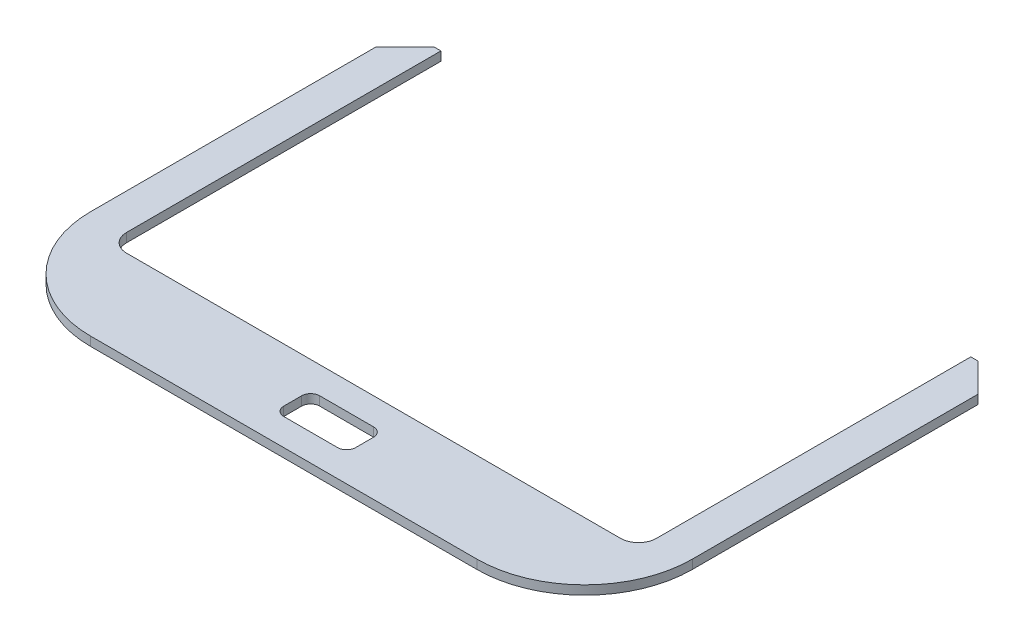
ISO-10303-21;
HEADER;
FILE_DESCRIPTION(('STEP AP214'),'2;1');
FILE_NAME('part.step','',(''),(''),'','','');
FILE_SCHEMA(('AUTOMOTIVE_DESIGN { 1 0 10303 214 1 1 1 1 }'));
ENDSEC;
DATA;
#1=APPLICATION_CONTEXT('core data for automotive mechanical design processes');
#2=APPLICATION_PROTOCOL_DEFINITION('international standard','automotive_design',2000,#1);
#3=PRODUCT_CONTEXT('',#1,'mechanical');
#4=PRODUCT('Part','Part','',(#3));
#5=PRODUCT_RELATED_PRODUCT_CATEGORY('part','',(#4));
#6=PRODUCT_DEFINITION_FORMATION('','',#4);
#7=PRODUCT_DEFINITION_CONTEXT('part definition',#1,'design');
#8=PRODUCT_DEFINITION('design','',#6,#7);
#9=PRODUCT_DEFINITION_SHAPE('','',#8);
#10=(LENGTH_UNIT() NAMED_UNIT(*) SI_UNIT(.MILLI.,.METRE.));
#11=(NAMED_UNIT(*) PLANE_ANGLE_UNIT() SI_UNIT($,.RADIAN.));
#12=(NAMED_UNIT(*) SI_UNIT($,.STERADIAN.) SOLID_ANGLE_UNIT());
#13=UNCERTAINTY_MEASURE_WITH_UNIT(LENGTH_MEASURE(1.E-05),#10,'distance_accuracy_value','');
#14=(GEOMETRIC_REPRESENTATION_CONTEXT(3) GLOBAL_UNCERTAINTY_ASSIGNED_CONTEXT((#13)) GLOBAL_UNIT_ASSIGNED_CONTEXT((#10,
#11,#12)) REPRESENTATION_CONTEXT('',''));
#15=CARTESIAN_POINT('',(0.,0.,0.));
#16=DIRECTION('',(0.,0.,1.));
#17=DIRECTION('',(1.,0.,0.));
#18=AXIS2_PLACEMENT_3D('',#15,#16,#17);
#19=CARTESIAN_POINT('',(53.18125,0.79375,-58.7375));
#20=DIRECTION('',(-1.,0.,0.));
#21=DIRECTION('',(0.,0.,1.));
#22=AXIS2_PLACEMENT_3D('',#19,#20,#21);
#23=PLANE('',#22);
#24=DIRECTION('',(0.,0.,-1.));
#25=VECTOR('',#24,1.);
#26=CARTESIAN_POINT('',(53.18125,-0.79375,-58.7375));
#27=LINE('',#26,#25);
#28=CARTESIAN_POINT('',(53.18125,-0.79375,-3.175));
#29=VERTEX_POINT('',#28);
#30=CARTESIAN_POINT('',(53.18125,-0.79375,-53.6575));
#31=VERTEX_POINT('',#30);
#32=EDGE_CURVE('E240',#29,#31,#27,.T.);
#33=ORIENTED_EDGE('',*,*,#32,.T.);
#34=DIRECTION('',(0.,1.,0.));
#35=VECTOR('',#34,1.);
#36=CARTESIAN_POINT('',(53.18125,0.79375,-53.6575));
#37=LINE('',#36,#35);
#38=CARTESIAN_POINT('',(53.18125,0.79375,-53.6575));
#39=VERTEX_POINT('',#38);
#40=EDGE_CURVE('E359',#31,#39,#37,.T.);
#41=ORIENTED_EDGE('',*,*,#40,.T.);
#42=DIRECTION('',(0.,0.,-1.));
#43=VECTOR('',#42,1.);
#44=CARTESIAN_POINT('',(53.18125,0.79375,-58.7375));
#45=LINE('',#44,#43);
#46=CARTESIAN_POINT('',(53.18125,0.79375,-3.175));
#47=VERTEX_POINT('',#46);
#48=EDGE_CURVE('E202',#47,#39,#45,.T.);
#49=ORIENTED_EDGE('',*,*,#48,.F.);
#50=DIRECTION('',(0.,-1.,0.));
#51=VECTOR('',#50,1.);
#52=CARTESIAN_POINT('',(53.18125,0.79375,-3.175));
#53=LINE('',#52,#51);
#54=EDGE_CURVE('E213',#47,#29,#53,.T.);
#55=ORIENTED_EDGE('',*,*,#54,.T.);
#56=EDGE_LOOP('',(#33,#41,#49,#55));
#57=FACE_BOUND('',#56,.T.);
#58=ADVANCED_FACE('F41',(#57),#23,.F.);
#59=CARTESIAN_POINT('',(46.83125,0.79375,-58.7375));
#60=DIRECTION('',(0.,0.,1.));
#61=DIRECTION('',(1.,0.,0.));
#62=AXIS2_PLACEMENT_3D('',#59,#60,#61);
#63=PLANE('',#62);
#64=DIRECTION('',(-1.,0.,0.));
#65=VECTOR('',#64,1.);
#66=CARTESIAN_POINT('',(46.83125,0.79375,-58.7375));
#67=LINE('',#66,#65);
#68=CARTESIAN_POINT('',(48.10125,0.79375,-58.7375));
#69=VERTEX_POINT('',#68);
#70=CARTESIAN_POINT('',(46.83125,0.79375,-58.7375));
#71=VERTEX_POINT('',#70);
#72=EDGE_CURVE('E189',#69,#71,#67,.T.);
#73=ORIENTED_EDGE('',*,*,#72,.F.);
#74=DIRECTION('',(0.,-1.,0.));
#75=VECTOR('',#74,1.);
#76=CARTESIAN_POINT('',(48.10125,0.79375,-58.7375));
#77=LINE('',#76,#75);
#78=CARTESIAN_POINT('',(48.10125,-0.79375,-58.7375));
#79=VERTEX_POINT('',#78);
#80=EDGE_CURVE('E350',#69,#79,#77,.T.);
#81=ORIENTED_EDGE('',*,*,#80,.T.);
#82=DIRECTION('',(-1.,0.,0.));
#83=VECTOR('',#82,1.);
#84=CARTESIAN_POINT('',(46.83125,-0.79375,-58.7375));
#85=LINE('',#84,#83);
#86=CARTESIAN_POINT('',(46.83125,-0.79375,-58.7375));
#87=VERTEX_POINT('',#86);
#88=EDGE_CURVE('E208',#79,#87,#85,.T.);
#89=ORIENTED_EDGE('',*,*,#88,.T.);
#90=DIRECTION('',(0.,-1.,0.));
#91=VECTOR('',#90,1.);
#92=CARTESIAN_POINT('',(46.83125,0.79375,-58.7375));
#93=LINE('',#92,#91);
#94=EDGE_CURVE('E205',#71,#87,#93,.T.);
#95=ORIENTED_EDGE('',*,*,#94,.F.);
#96=EDGE_LOOP('',(#73,#81,#89,#95));
#97=FACE_BOUND('',#96,.T.);
#98=ADVANCED_FACE('F206',(#97),#63,.F.);
#99=CARTESIAN_POINT('',(46.83125,0.79375,-58.7375));
#100=DIRECTION('',(1.,0.,0.));
#101=DIRECTION('',(0.,0.,-1.));
#102=AXIS2_PLACEMENT_3D('',#99,#100,#101);
#103=PLANE('',#102);
#104=DIRECTION('',(0.,0.,1.));
#105=VECTOR('',#104,1.);
#106=CARTESIAN_POINT('',(46.83125,-0.79375,-58.7375));
#107=LINE('',#106,#105);
#108=CARTESIAN_POINT('',(46.83125,-0.79375,-3.175));
#109=VERTEX_POINT('',#108);
#110=EDGE_CURVE('E247',#87,#109,#107,.T.);
#111=ORIENTED_EDGE('',*,*,#110,.T.);
#112=DIRECTION('',(0.,-1.,0.));
#113=VECTOR('',#112,1.);
#114=CARTESIAN_POINT('',(46.83125,0.79375,-3.175));
#115=LINE('',#114,#113);
#116=CARTESIAN_POINT('',(46.83125,0.79375,-3.175));
#117=VERTEX_POINT('',#116);
#118=EDGE_CURVE('E218',#109,#117,#115,.F.);
#119=ORIENTED_EDGE('',*,*,#118,.T.);
#120=DIRECTION('',(0.,0.,1.));
#121=VECTOR('',#120,1.);
#122=CARTESIAN_POINT('',(46.83125,0.79375,-58.7375));
#123=LINE('',#122,#121);
#124=EDGE_CURVE('E194',#71,#117,#123,.T.);
#125=ORIENTED_EDGE('',*,*,#124,.F.);
#126=ORIENTED_EDGE('',*,*,#94,.T.);
#127=EDGE_LOOP('',(#111,#119,#125,#126));
#128=FACE_BOUND('',#127,.T.);
#129=ADVANCED_FACE('F216',(#128),#103,.F.);
#130=CARTESIAN_POINT('',(-46.83125,0.79375,0.));
#131=DIRECTION('',(0.,0.,1.));
#132=DIRECTION('',(1.,0.,0.));
#133=AXIS2_PLACEMENT_3D('',#130,#131,#132);
#134=PLANE('',#133);
#135=DIRECTION('',(-1.,0.,0.));
#136=VECTOR('',#135,1.);
#137=CARTESIAN_POINT('',(-46.83125,0.79375,0.));
#138=LINE('',#137,#136);
#139=CARTESIAN_POINT('',(43.65625,0.79375,0.));
#140=VERTEX_POINT('',#139);
#141=CARTESIAN_POINT('',(-43.65625,0.79375,0.));
#142=VERTEX_POINT('',#141);
#143=EDGE_CURVE('E220',#140,#142,#138,.T.);
#144=ORIENTED_EDGE('',*,*,#143,.F.);
#145=DIRECTION('',(0.,-1.,0.));
#146=VECTOR('',#145,1.);
#147=CARTESIAN_POINT('',(43.65625,-0.79375,0.));
#148=LINE('',#147,#146);
#149=CARTESIAN_POINT('',(43.65625,-0.79375,0.));
#150=VERTEX_POINT('',#149);
#151=EDGE_CURVE('E377',#140,#150,#148,.T.);
#152=ORIENTED_EDGE('',*,*,#151,.T.);
#153=DIRECTION('',(-1.,0.,0.));
#154=VECTOR('',#153,1.);
#155=CARTESIAN_POINT('',(-46.83125,-0.79375,0.));
#156=LINE('',#155,#154);
#157=CARTESIAN_POINT('',(-43.65625,-0.79375,0.));
#158=VERTEX_POINT('',#157);
#159=EDGE_CURVE('E250',#150,#158,#156,.T.);
#160=ORIENTED_EDGE('',*,*,#159,.T.);
#161=DIRECTION('',(0.,-1.,0.));
#162=VECTOR('',#161,1.);
#163=CARTESIAN_POINT('',(-43.65625,0.79375,0.));
#164=LINE('',#163,#162);
#165=EDGE_CURVE('E374',#158,#142,#164,.F.);
#166=ORIENTED_EDGE('',*,*,#165,.T.);
#167=EDGE_LOOP('',(#144,#152,#160,#166));
#168=FACE_BOUND('',#167,.T.);
#169=ADVANCED_FACE('F399',(#168),#134,.F.);
#170=CARTESIAN_POINT('',(-46.83125,0.79375,-58.7375));
#171=DIRECTION('',(-1.,0.,0.));
#172=DIRECTION('',(0.,0.,1.));
#173=AXIS2_PLACEMENT_3D('',#170,#171,#172);
#174=PLANE('',#173);
#175=DIRECTION('',(0.,0.,-1.));
#176=VECTOR('',#175,1.);
#177=CARTESIAN_POINT('',(-46.83125,0.79375,-58.7375));
#178=LINE('',#177,#176);
#179=CARTESIAN_POINT('',(-46.83125,0.79375,-3.175));
#180=VERTEX_POINT('',#179);
#181=CARTESIAN_POINT('',(-46.83125,0.79375,-58.7375));
#182=VERTEX_POINT('',#181);
#183=EDGE_CURVE('E223',#180,#182,#178,.T.);
#184=ORIENTED_EDGE('',*,*,#183,.F.);
#185=DIRECTION('',(0.,-1.,0.));
#186=VECTOR('',#185,1.);
#187=CARTESIAN_POINT('',(-46.83125,-0.79375,-3.175));
#188=LINE('',#187,#186);
#189=CARTESIAN_POINT('',(-46.83125,-0.79375,-3.175));
#190=VERTEX_POINT('',#189);
#191=EDGE_CURVE('E383',#180,#190,#188,.T.);
#192=ORIENTED_EDGE('',*,*,#191,.T.);
#193=DIRECTION('',(0.,0.,-1.));
#194=VECTOR('',#193,1.);
#195=CARTESIAN_POINT('',(-46.83125,-0.79375,-58.7375));
#196=LINE('',#195,#194);
#197=CARTESIAN_POINT('',(-46.83125,-0.79375,-58.7375));
#198=VERTEX_POINT('',#197);
#199=EDGE_CURVE('E254',#190,#198,#196,.T.);
#200=ORIENTED_EDGE('',*,*,#199,.T.);
#201=DIRECTION('',(0.,-1.,0.));
#202=VECTOR('',#201,1.);
#203=CARTESIAN_POINT('',(-46.83125,0.79375,-58.7375));
#204=LINE('',#203,#202);
#205=EDGE_CURVE('E214',#182,#198,#204,.T.);
#206=ORIENTED_EDGE('',*,*,#205,.F.);
#207=EDGE_LOOP('',(#184,#192,#200,#206));
#208=FACE_BOUND('',#207,.T.);
#209=ADVANCED_FACE('F402',(#208),#174,.F.);
#210=CARTESIAN_POINT('',(-53.18125,0.79375,-58.7375));
#211=DIRECTION('',(0.,0.,1.));
#212=DIRECTION('',(1.,0.,0.));
#213=AXIS2_PLACEMENT_3D('',#210,#211,#212);
#214=PLANE('',#213);
#215=DIRECTION('',(-1.,0.,0.));
#216=VECTOR('',#215,1.);
#217=CARTESIAN_POINT('',(-53.18125,-0.79375,-58.7375));
#218=LINE('',#217,#216);
#219=CARTESIAN_POINT('',(-48.10125,-0.79375,-58.7375));
#220=VERTEX_POINT('',#219);
#221=EDGE_CURVE('E257',#198,#220,#218,.T.);
#222=ORIENTED_EDGE('',*,*,#221,.T.);
#223=DIRECTION('',(0.,1.,0.));
#224=VECTOR('',#223,1.);
#225=CARTESIAN_POINT('',(-48.10125,0.79375,-58.7375));
#226=LINE('',#225,#224);
#227=CARTESIAN_POINT('',(-48.10125,0.79375,-58.7375));
#228=VERTEX_POINT('',#227);
#229=EDGE_CURVE('E371',#220,#228,#226,.T.);
#230=ORIENTED_EDGE('',*,*,#229,.T.);
#231=DIRECTION('',(-1.,0.,0.));
#232=VECTOR('',#231,1.);
#233=CARTESIAN_POINT('',(-53.18125,0.79375,-58.7375));
#234=LINE('',#233,#232);
#235=EDGE_CURVE('E229',#182,#228,#234,.T.);
#236=ORIENTED_EDGE('',*,*,#235,.F.);
#237=ORIENTED_EDGE('',*,*,#205,.T.);
#238=EDGE_LOOP('',(#222,#230,#236,#237));
#239=FACE_BOUND('',#238,.T.);
#240=ADVANCED_FACE('F582',(#239),#214,.F.);
#241=CARTESIAN_POINT('',(-53.18125,0.79375,-58.7375));
#242=DIRECTION('',(1.,0.,0.));
#243=DIRECTION('',(0.,0.,-1.));
#244=AXIS2_PLACEMENT_3D('',#241,#242,#243);
#245=PLANE('',#244);
#246=DIRECTION('',(0.,0.,1.));
#247=VECTOR('',#246,1.);
#248=CARTESIAN_POINT('',(-53.18125,0.79375,-58.7375));
#249=LINE('',#248,#247);
#250=CARTESIAN_POINT('',(-53.18125,0.79375,-53.6575));
#251=VERTEX_POINT('',#250);
#252=CARTESIAN_POINT('',(-53.18125,0.79375,-3.175));
#253=VERTEX_POINT('',#252);
#254=EDGE_CURVE('E233',#251,#253,#249,.T.);
#255=ORIENTED_EDGE('',*,*,#254,.F.);
#256=DIRECTION('',(0.,-1.,0.));
#257=VECTOR('',#256,1.);
#258=CARTESIAN_POINT('',(-53.18125,0.79375,-53.6575));
#259=LINE('',#258,#257);
#260=CARTESIAN_POINT('',(-53.18125,-0.79375,-53.6575));
#261=VERTEX_POINT('',#260);
#262=EDGE_CURVE('E367',#251,#261,#259,.T.);
#263=ORIENTED_EDGE('',*,*,#262,.T.);
#264=DIRECTION('',(0.,0.,1.));
#265=VECTOR('',#264,1.);
#266=CARTESIAN_POINT('',(-53.18125,-0.79375,-58.7375));
#267=LINE('',#266,#265);
#268=CARTESIAN_POINT('',(-53.18125,-0.79375,-3.175));
#269=VERTEX_POINT('',#268);
#270=EDGE_CURVE('E261',#261,#269,#267,.T.);
#271=ORIENTED_EDGE('',*,*,#270,.T.);
#272=DIRECTION('',(0.,-1.,0.));
#273=VECTOR('',#272,1.);
#274=CARTESIAN_POINT('',(-53.18125,0.79375,-3.175));
#275=LINE('',#274,#273);
#276=EDGE_CURVE('E294',#269,#253,#275,.F.);
#277=ORIENTED_EDGE('',*,*,#276,.T.);
#278=EDGE_LOOP('',(#255,#263,#271,#277));
#279=FACE_BOUND('',#278,.T.);
#280=ADVANCED_FACE('F414',(#279),#245,.F.);
#281=CARTESIAN_POINT('',(-53.18125,0.79375,15.875));
#282=DIRECTION('',(0.,0.,-1.));
#283=DIRECTION('',(-1.,0.,0.));
#284=AXIS2_PLACEMENT_3D('',#281,#282,#283);
#285=PLANE('',#284);
#286=DIRECTION('',(1.,0.,0.));
#287=VECTOR('',#286,1.);
#288=CARTESIAN_POINT('',(-53.18125,-0.79375,15.875));
#289=LINE('',#288,#287);
#290=CARTESIAN_POINT('',(-34.13125,-0.79375,15.875));
#291=VERTEX_POINT('',#290);
#292=CARTESIAN_POINT('',(34.13125,-0.79375,15.875));
#293=VERTEX_POINT('',#292);
#294=EDGE_CURVE('E264',#291,#293,#289,.T.);
#295=ORIENTED_EDGE('',*,*,#294,.T.);
#296=DIRECTION('',(0.,-1.,0.));
#297=VECTOR('',#296,1.);
#298=CARTESIAN_POINT('',(34.13125,0.79375,15.875));
#299=LINE('',#298,#297);
#300=CARTESIAN_POINT('',(34.13125,0.79375,15.875));
#301=VERTEX_POINT('',#300);
#302=EDGE_CURVE('E285',#293,#301,#299,.F.);
#303=ORIENTED_EDGE('',*,*,#302,.T.);
#304=DIRECTION('',(1.,0.,0.));
#305=VECTOR('',#304,1.);
#306=CARTESIAN_POINT('',(-53.18125,0.79375,15.875));
#307=LINE('',#306,#305);
#308=CARTESIAN_POINT('',(-34.13125,0.79375,15.875));
#309=VERTEX_POINT('',#308);
#310=EDGE_CURVE('E236',#309,#301,#307,.T.);
#311=ORIENTED_EDGE('',*,*,#310,.F.);
#312=DIRECTION('',(0.,-1.,0.));
#313=VECTOR('',#312,1.);
#314=CARTESIAN_POINT('',(-34.13125,0.79375,15.875));
#315=LINE('',#314,#313);
#316=EDGE_CURVE('E281',#309,#291,#315,.T.);
#317=ORIENTED_EDGE('',*,*,#316,.T.);
#318=EDGE_LOOP('',(#295,#303,#311,#317));
#319=FACE_BOUND('',#318,.T.);
#320=ADVANCED_FACE('F424',(#319),#285,.F.);
#321=CARTESIAN_POINT('',(0.,0.79375,0.));
#322=DIRECTION('',(0.,1.,0.));
#323=DIRECTION('',(0.,0.,1.));
#324=AXIS2_PLACEMENT_3D('',#321,#322,#323);
#325=PLANE('',#324);
#326=DIRECTION('',(0.,0.,-1.));
#327=VECTOR('',#326,1.);
#328=CARTESIAN_POINT('',(6.35,0.79375,0.));
#329=LINE('',#328,#327);
#330=CARTESIAN_POINT('',(6.35,0.79375,9.525));
#331=VERTEX_POINT('',#330);
#332=CARTESIAN_POINT('',(6.35,0.79375,6.35));
#333=VERTEX_POINT('',#332);
#334=EDGE_CURVE('E244',#331,#333,#329,.T.);
#335=ORIENTED_EDGE('',*,*,#334,.F.);
#336=CARTESIAN_POINT('',(4.7625,0.79375,9.525));
#337=DIRECTION('',(0.,1.,0.));
#338=DIRECTION('',(0.,0.,1.));
#339=AXIS2_PLACEMENT_3D('',#336,#337,#338);
#340=CIRCLE('',#339,1.5875);
#341=CARTESIAN_POINT('',(4.7625,0.79375,11.1125));
#342=VERTEX_POINT('',#341);
#343=EDGE_CURVE('E326',#331,#342,#340,.F.);
#344=ORIENTED_EDGE('',*,*,#343,.T.);
#345=DIRECTION('',(1.,0.,0.));
#346=VECTOR('',#345,1.);
#347=CARTESIAN_POINT('',(0.,0.79375,11.1125));
#348=LINE('',#347,#346);
#349=CARTESIAN_POINT('',(-4.7625,0.79375,11.1125));
#350=VERTEX_POINT('',#349);
#351=EDGE_CURVE('E438',#350,#342,#348,.T.);
#352=ORIENTED_EDGE('',*,*,#351,.F.);
#353=CARTESIAN_POINT('',(-4.7625,0.79375,9.525));
#354=DIRECTION('',(0.,1.,0.));
#355=DIRECTION('',(0.,0.,1.));
#356=AXIS2_PLACEMENT_3D('',#353,#354,#355);
#357=CIRCLE('',#356,1.5875);
#358=CARTESIAN_POINT('',(-6.35,0.79375,9.525));
#359=VERTEX_POINT('',#358);
#360=EDGE_CURVE('E338',#350,#359,#357,.F.);
#361=ORIENTED_EDGE('',*,*,#360,.T.);
#362=DIRECTION('',(0.,0.,1.));
#363=VECTOR('',#362,1.);
#364=CARTESIAN_POINT('',(-6.35,0.79375,0.));
#365=LINE('',#364,#363);
#366=CARTESIAN_POINT('',(-6.35,0.79375,6.35));
#367=VERTEX_POINT('',#366);
#368=EDGE_CURVE('E442',#367,#359,#365,.T.);
#369=ORIENTED_EDGE('',*,*,#368,.F.);
#370=CARTESIAN_POINT('',(-4.7625,0.79375,6.35));
#371=DIRECTION('',(0.,1.,0.));
#372=DIRECTION('',(0.,0.,1.));
#373=AXIS2_PLACEMENT_3D('',#370,#371,#372);
#374=CIRCLE('',#373,1.5875);
#375=CARTESIAN_POINT('',(-4.7625,0.79375,4.7625));
#376=VERTEX_POINT('',#375);
#377=EDGE_CURVE('E344',#367,#376,#374,.F.);
#378=ORIENTED_EDGE('',*,*,#377,.T.);
#379=DIRECTION('',(-1.,0.,0.));
#380=VECTOR('',#379,1.);
#381=CARTESIAN_POINT('',(0.,0.79375,4.7625));
#382=LINE('',#381,#380);
#383=CARTESIAN_POINT('',(4.7625,0.79375,4.7625));
#384=VERTEX_POINT('',#383);
#385=EDGE_CURVE('E446',#384,#376,#382,.T.);
#386=ORIENTED_EDGE('',*,*,#385,.F.);
#387=CARTESIAN_POINT('',(4.7625,0.79375,6.35));
#388=DIRECTION('',(0.,1.,0.));
#389=DIRECTION('',(0.,0.,1.));
#390=AXIS2_PLACEMENT_3D('',#387,#388,#389);
#391=CIRCLE('',#390,1.5875);
#392=EDGE_CURVE('E332',#384,#333,#391,.F.);
#393=ORIENTED_EDGE('',*,*,#392,.T.);
#394=EDGE_LOOP('',(#335,#344,#352,#361,#369,#378,#386,#393));
#395=FACE_BOUND('',#394,.T.);
#396=ORIENTED_EDGE('',*,*,#48,.T.);
#397=DIRECTION('',(0.707106781186548,0.,0.707106781186548));
#398=VECTOR('',#397,1.);
#399=CARTESIAN_POINT('',(53.419375,0.79375,-53.419375));
#400=LINE('',#399,#398);
#401=EDGE_CURVE('E197',#39,#69,#400,.F.);
#402=ORIENTED_EDGE('',*,*,#401,.T.);
#403=ORIENTED_EDGE('',*,*,#72,.T.);
#404=ORIENTED_EDGE('',*,*,#124,.T.);
#405=CARTESIAN_POINT('',(43.65625,0.79375,-3.175));
#406=DIRECTION('',(0.,1.,0.));
#407=DIRECTION('',(0.,0.,1.));
#408=AXIS2_PLACEMENT_3D('',#405,#406,#407);
#409=CIRCLE('',#408,3.175);
#410=EDGE_CURVE('E389',#117,#140,#409,.F.);
#411=ORIENTED_EDGE('',*,*,#410,.T.);
#412=ORIENTED_EDGE('',*,*,#143,.T.);
#413=CARTESIAN_POINT('',(-43.65625,0.79375,-3.175));
#414=DIRECTION('',(0.,1.,0.));
#415=DIRECTION('',(0.,0.,1.));
#416=AXIS2_PLACEMENT_3D('',#413,#414,#415);
#417=CIRCLE('',#416,3.175);
#418=EDGE_CURVE('E11',#142,#180,#417,.F.);
#419=ORIENTED_EDGE('',*,*,#418,.T.);
#420=ORIENTED_EDGE('',*,*,#183,.T.);
#421=ORIENTED_EDGE('',*,*,#235,.T.);
#422=DIRECTION('',(0.70710678118655,0.,-0.707106781186546));
#423=VECTOR('',#422,1.);
#424=CARTESIAN_POINT('',(-53.4193749999999,0.79375,-53.4193750000002));
#425=LINE('',#424,#423);
#426=EDGE_CURVE('E362',#228,#251,#425,.F.);
#427=ORIENTED_EDGE('',*,*,#426,.T.);
#428=ORIENTED_EDGE('',*,*,#254,.T.);
#429=CARTESIAN_POINT('',(-34.13125,0.79375,-3.175));
#430=DIRECTION('',(0.,1.,0.));
#431=DIRECTION('',(0.,0.,1.));
#432=AXIS2_PLACEMENT_3D('',#429,#430,#431);
#433=CIRCLE('',#432,19.05);
#434=EDGE_CURVE('E288',#253,#309,#433,.T.);
#435=ORIENTED_EDGE('',*,*,#434,.T.);
#436=ORIENTED_EDGE('',*,*,#310,.T.);
#437=CARTESIAN_POINT('',(34.13125,0.79375,-3.175));
#438=DIRECTION('',(0.,1.,0.));
#439=DIRECTION('',(0.,0.,1.));
#440=AXIS2_PLACEMENT_3D('',#437,#438,#439);
#441=CIRCLE('',#440,19.05);
#442=EDGE_CURVE('E291',#301,#47,#441,.T.);
#443=ORIENTED_EDGE('',*,*,#442,.T.);
#444=EDGE_LOOP('',(#396,#402,#403,#404,#411,#412,#419,#420,#421,#427,#428,#435,#436,#443));
#445=FACE_BOUND('',#444,.T.);
#446=ADVANCED_FACE('F192',(#395,#445),#325,.T.);
#447=CARTESIAN_POINT('',(0.,-0.79375,0.));
#448=DIRECTION('',(0.,1.,0.));
#449=DIRECTION('',(0.,0.,1.));
#450=AXIS2_PLACEMENT_3D('',#447,#448,#449);
#451=PLANE('',#450);
#452=DIRECTION('',(0.,0.,1.));
#453=VECTOR('',#452,1.);
#454=CARTESIAN_POINT('',(-6.35,-0.79375,4.7625));
#455=LINE('',#454,#453);
#456=CARTESIAN_POINT('',(-6.35,-0.79375,6.35));
#457=VERTEX_POINT('',#456);
#458=CARTESIAN_POINT('',(-6.35,-0.79375,9.525));
#459=VERTEX_POINT('',#458);
#460=EDGE_CURVE('E454',#457,#459,#455,.T.);
#461=ORIENTED_EDGE('',*,*,#460,.T.);
#462=CARTESIAN_POINT('',(-4.7625,-0.79375,9.525));
#463=DIRECTION('',(0.,1.,0.));
#464=DIRECTION('',(0.,0.,1.));
#465=AXIS2_PLACEMENT_3D('',#462,#463,#464);
#466=CIRCLE('',#465,1.5875);
#467=CARTESIAN_POINT('',(-4.7625,-0.79375,11.1125));
#468=VERTEX_POINT('',#467);
#469=EDGE_CURVE('E341',#459,#468,#466,.T.);
#470=ORIENTED_EDGE('',*,*,#469,.T.);
#471=DIRECTION('',(1.,0.,0.));
#472=VECTOR('',#471,1.);
#473=CARTESIAN_POINT('',(-6.35,-0.79375,11.1125));
#474=LINE('',#473,#472);
#475=CARTESIAN_POINT('',(4.7625,-0.79375,11.1125));
#476=VERTEX_POINT('',#475);
#477=EDGE_CURVE('E450',#468,#476,#474,.T.);
#478=ORIENTED_EDGE('',*,*,#477,.T.);
#479=CARTESIAN_POINT('',(4.7625,-0.79375,9.525));
#480=DIRECTION('',(0.,1.,0.));
#481=DIRECTION('',(0.,0.,1.));
#482=AXIS2_PLACEMENT_3D('',#479,#480,#481);
#483=CIRCLE('',#482,1.5875);
#484=CARTESIAN_POINT('',(6.35,-0.79375,9.525));
#485=VERTEX_POINT('',#484);
#486=EDGE_CURVE('E329',#476,#485,#483,.T.);
#487=ORIENTED_EDGE('',*,*,#486,.T.);
#488=DIRECTION('',(0.,0.,-1.));
#489=VECTOR('',#488,1.);
#490=CARTESIAN_POINT('',(6.35,-0.79375,4.7625));
#491=LINE('',#490,#489);
#492=CARTESIAN_POINT('',(6.35,-0.79375,6.35));
#493=VERTEX_POINT('',#492);
#494=EDGE_CURVE('E462',#485,#493,#491,.T.);
#495=ORIENTED_EDGE('',*,*,#494,.T.);
#496=CARTESIAN_POINT('',(4.7625,-0.79375,6.35));
#497=DIRECTION('',(0.,1.,0.));
#498=DIRECTION('',(0.,0.,1.));
#499=AXIS2_PLACEMENT_3D('',#496,#497,#498);
#500=CIRCLE('',#499,1.5875);
#501=CARTESIAN_POINT('',(4.7625,-0.79375,4.7625));
#502=VERTEX_POINT('',#501);
#503=EDGE_CURVE('E335',#493,#502,#500,.T.);
#504=ORIENTED_EDGE('',*,*,#503,.T.);
#505=DIRECTION('',(-1.,0.,0.));
#506=VECTOR('',#505,1.);
#507=CARTESIAN_POINT('',(-6.35,-0.79375,4.7625));
#508=LINE('',#507,#506);
#509=CARTESIAN_POINT('',(-4.7625,-0.79375,4.7625));
#510=VERTEX_POINT('',#509);
#511=EDGE_CURVE('E458',#502,#510,#508,.T.);
#512=ORIENTED_EDGE('',*,*,#511,.T.);
#513=CARTESIAN_POINT('',(-4.7625,-0.79375,6.35));
#514=DIRECTION('',(0.,1.,0.));
#515=DIRECTION('',(0.,0.,1.));
#516=AXIS2_PLACEMENT_3D('',#513,#514,#515);
#517=CIRCLE('',#516,1.5875);
#518=EDGE_CURVE('E347',#510,#457,#517,.T.);
#519=ORIENTED_EDGE('',*,*,#518,.T.);
#520=EDGE_LOOP('',(#461,#470,#478,#487,#495,#504,#512,#519));
#521=FACE_BOUND('',#520,.T.);
#522=ORIENTED_EDGE('',*,*,#88,.F.);
#523=DIRECTION('',(-0.707106781186548,0.,-0.707106781186548));
#524=VECTOR('',#523,1.);
#525=CARTESIAN_POINT('',(48.10125,-0.79375,-58.7375));
#526=LINE('',#525,#524);
#527=EDGE_CURVE('E356',#79,#31,#526,.F.);
#528=ORIENTED_EDGE('',*,*,#527,.T.);
#529=ORIENTED_EDGE('',*,*,#32,.F.);
#530=CARTESIAN_POINT('',(34.13125,-0.79375,-3.175));
#531=DIRECTION('',(0.,1.,0.));
#532=DIRECTION('',(0.,0.,1.));
#533=AXIS2_PLACEMENT_3D('',#530,#531,#532);
#534=CIRCLE('',#533,19.05);
#535=EDGE_CURVE('E278',#29,#293,#534,.F.);
#536=ORIENTED_EDGE('',*,*,#535,.T.);
#537=ORIENTED_EDGE('',*,*,#294,.F.);
#538=CARTESIAN_POINT('',(-34.13125,-0.79375,-3.175));
#539=DIRECTION('',(0.,1.,0.));
#540=DIRECTION('',(0.,0.,1.));
#541=AXIS2_PLACEMENT_3D('',#538,#539,#540);
#542=CIRCLE('',#541,19.05);
#543=EDGE_CURVE('E274',#291,#269,#542,.F.);
#544=ORIENTED_EDGE('',*,*,#543,.T.);
#545=ORIENTED_EDGE('',*,*,#270,.F.);
#546=DIRECTION('',(-0.70710678118655,0.,0.707106781186546));
#547=VECTOR('',#546,1.);
#548=CARTESIAN_POINT('',(-53.18125,-0.79375,-53.6575));
#549=LINE('',#548,#547);
#550=EDGE_CURVE('E353',#261,#220,#549,.F.);
#551=ORIENTED_EDGE('',*,*,#550,.T.);
#552=ORIENTED_EDGE('',*,*,#221,.F.);
#553=ORIENTED_EDGE('',*,*,#199,.F.);
#554=CARTESIAN_POINT('',(-43.65625,-0.79375,-3.175));
#555=DIRECTION('',(0.,1.,0.));
#556=DIRECTION('',(0.,0.,1.));
#557=AXIS2_PLACEMENT_3D('',#554,#555,#556);
#558=CIRCLE('',#557,3.175);
#559=EDGE_CURVE('E50',#190,#158,#558,.T.);
#560=ORIENTED_EDGE('',*,*,#559,.T.);
#561=ORIENTED_EDGE('',*,*,#159,.F.);
#562=CARTESIAN_POINT('',(43.65625,-0.79375,-3.175));
#563=DIRECTION('',(0.,1.,0.));
#564=DIRECTION('',(0.,0.,1.));
#565=AXIS2_PLACEMENT_3D('',#562,#563,#564);
#566=CIRCLE('',#565,3.175);
#567=EDGE_CURVE('E386',#150,#109,#566,.T.);
#568=ORIENTED_EDGE('',*,*,#567,.T.);
#569=ORIENTED_EDGE('',*,*,#110,.F.);
#570=EDGE_LOOP('',(#522,#528,#529,#536,#537,#544,#545,#551,#552,#553,#560,#561,#568,#569));
#571=FACE_BOUND('',#570,.T.);
#572=ADVANCED_FACE('F395',(#521,#571),#451,.F.);
#573=CARTESIAN_POINT('',(34.13125,0.79375,-3.175));
#574=DIRECTION('',(0.,-1.,0.));
#575=DIRECTION('',(0.,0.,-1.));
#576=AXIS2_PLACEMENT_3D('',#573,#574,#575);
#577=CYLINDRICAL_SURFACE('',#576,19.05);
#578=ORIENTED_EDGE('',*,*,#442,.F.);
#579=ORIENTED_EDGE('',*,*,#302,.F.);
#580=ORIENTED_EDGE('',*,*,#535,.F.);
#581=ORIENTED_EDGE('',*,*,#54,.F.);
#582=EDGE_LOOP('',(#578,#579,#580,#581));
#583=FACE_BOUND('',#582,.T.);
#584=ADVANCED_FACE('F427',(#583),#577,.T.);
#585=CARTESIAN_POINT('',(-34.13125,0.79375,-3.175));
#586=DIRECTION('',(0.,-1.,0.));
#587=DIRECTION('',(0.,0.,-1.));
#588=AXIS2_PLACEMENT_3D('',#585,#586,#587);
#589=CYLINDRICAL_SURFACE('',#588,19.05);
#590=ORIENTED_EDGE('',*,*,#434,.F.);
#591=ORIENTED_EDGE('',*,*,#276,.F.);
#592=ORIENTED_EDGE('',*,*,#543,.F.);
#593=ORIENTED_EDGE('',*,*,#316,.F.);
#594=EDGE_LOOP('',(#590,#591,#592,#593));
#595=FACE_BOUND('',#594,.T.);
#596=ADVANCED_FACE('F420',(#595),#589,.T.);
#597=CARTESIAN_POINT('',(6.35,-0.79375,4.7625));
#598=DIRECTION('',(1.,0.,0.));
#599=DIRECTION('',(0.,0.,-1.));
#600=AXIS2_PLACEMENT_3D('',#597,#598,#599);
#601=PLANE('',#600);
#602=ORIENTED_EDGE('',*,*,#494,.F.);
#603=DIRECTION('',(0.,1.,0.));
#604=VECTOR('',#603,1.);
#605=CARTESIAN_POINT('',(6.35,0.79375,9.525));
#606=LINE('',#605,#604);
#607=EDGE_CURVE('E301',#485,#331,#606,.T.);
#608=ORIENTED_EDGE('',*,*,#607,.T.);
#609=ORIENTED_EDGE('',*,*,#334,.T.);
#610=DIRECTION('',(0.,1.,0.));
#611=VECTOR('',#610,1.);
#612=CARTESIAN_POINT('',(6.35,-0.79375,6.35));
#613=LINE('',#612,#611);
#614=EDGE_CURVE('E298',#333,#493,#613,.F.);
#615=ORIENTED_EDGE('',*,*,#614,.T.);
#616=EDGE_LOOP('',(#602,#608,#609,#615));
#617=FACE_BOUND('',#616,.T.);
#618=ADVANCED_FACE('F502',(#617),#601,.F.);
#619=CARTESIAN_POINT('',(-6.35,-0.79375,11.1125));
#620=DIRECTION('',(0.,0.,1.));
#621=DIRECTION('',(1.,0.,0.));
#622=AXIS2_PLACEMENT_3D('',#619,#620,#621);
#623=PLANE('',#622);
#624=ORIENTED_EDGE('',*,*,#351,.T.);
#625=DIRECTION('',(0.,1.,0.));
#626=VECTOR('',#625,1.);
#627=CARTESIAN_POINT('',(4.7625,-0.79375,11.1125));
#628=LINE('',#627,#626);
#629=EDGE_CURVE('E309',#342,#476,#628,.F.);
#630=ORIENTED_EDGE('',*,*,#629,.T.);
#631=ORIENTED_EDGE('',*,*,#477,.F.);
#632=DIRECTION('',(0.,1.,0.));
#633=VECTOR('',#632,1.);
#634=CARTESIAN_POINT('',(-4.7625,0.79375,11.1125));
#635=LINE('',#634,#633);
#636=EDGE_CURVE('E305',#468,#350,#635,.T.);
#637=ORIENTED_EDGE('',*,*,#636,.T.);
#638=EDGE_LOOP('',(#624,#630,#631,#637));
#639=FACE_BOUND('',#638,.T.);
#640=ADVANCED_FACE('F498',(#639),#623,.F.);
#641=CARTESIAN_POINT('',(-6.35,-0.79375,4.7625));
#642=DIRECTION('',(-1.,0.,0.));
#643=DIRECTION('',(0.,0.,1.));
#644=AXIS2_PLACEMENT_3D('',#641,#642,#643);
#645=PLANE('',#644);
#646=ORIENTED_EDGE('',*,*,#368,.T.);
#647=DIRECTION('',(0.,1.,0.));
#648=VECTOR('',#647,1.);
#649=CARTESIAN_POINT('',(-6.35,-0.79375,9.525));
#650=LINE('',#649,#648);
#651=EDGE_CURVE('E323',#359,#459,#650,.F.);
#652=ORIENTED_EDGE('',*,*,#651,.T.);
#653=ORIENTED_EDGE('',*,*,#460,.F.);
#654=DIRECTION('',(0.,1.,0.));
#655=VECTOR('',#654,1.);
#656=CARTESIAN_POINT('',(-6.35,0.79375,6.35));
#657=LINE('',#656,#655);
#658=EDGE_CURVE('E319',#457,#367,#657,.T.);
#659=ORIENTED_EDGE('',*,*,#658,.T.);
#660=EDGE_LOOP('',(#646,#652,#653,#659));
#661=FACE_BOUND('',#660,.T.);
#662=ADVANCED_FACE('F489',(#661),#645,.F.);
#663=CARTESIAN_POINT('',(-6.35,-0.79375,4.7625));
#664=DIRECTION('',(0.,0.,-1.));
#665=DIRECTION('',(-1.,0.,0.));
#666=AXIS2_PLACEMENT_3D('',#663,#664,#665);
#667=PLANE('',#666);
#668=ORIENTED_EDGE('',*,*,#511,.F.);
#669=DIRECTION('',(0.,1.,0.));
#670=VECTOR('',#669,1.);
#671=CARTESIAN_POINT('',(4.7625,0.79375,4.7625));
#672=LINE('',#671,#670);
#673=EDGE_CURVE('E315',#502,#384,#672,.T.);
#674=ORIENTED_EDGE('',*,*,#673,.T.);
#675=ORIENTED_EDGE('',*,*,#385,.T.);
#676=DIRECTION('',(0.,1.,0.));
#677=VECTOR('',#676,1.);
#678=CARTESIAN_POINT('',(-4.7625,-0.79375,4.7625));
#679=LINE('',#678,#677);
#680=EDGE_CURVE('E312',#376,#510,#679,.F.);
#681=ORIENTED_EDGE('',*,*,#680,.T.);
#682=EDGE_LOOP('',(#668,#674,#675,#681));
#683=FACE_BOUND('',#682,.T.);
#684=ADVANCED_FACE('F478',(#683),#667,.F.);
#685=CARTESIAN_POINT('',(4.7625,-0.79375,9.525));
#686=DIRECTION('',(0.,-1.,0.));
#687=DIRECTION('',(0.,0.,-1.));
#688=AXIS2_PLACEMENT_3D('',#685,#686,#687);
#689=CYLINDRICAL_SURFACE('',#688,1.5875);
#690=ORIENTED_EDGE('',*,*,#486,.F.);
#691=ORIENTED_EDGE('',*,*,#629,.F.);
#692=ORIENTED_EDGE('',*,*,#343,.F.);
#693=ORIENTED_EDGE('',*,*,#607,.F.);
#694=EDGE_LOOP('',(#690,#691,#692,#693));
#695=FACE_BOUND('',#694,.T.);
#696=ADVANCED_FACE('F501',(#695),#689,.F.);
#697=CARTESIAN_POINT('',(4.7625,-0.79375,6.35));
#698=DIRECTION('',(0.,-1.,0.));
#699=DIRECTION('',(0.,0.,-1.));
#700=AXIS2_PLACEMENT_3D('',#697,#698,#699);
#701=CYLINDRICAL_SURFACE('',#700,1.5875);
#702=ORIENTED_EDGE('',*,*,#503,.F.);
#703=ORIENTED_EDGE('',*,*,#614,.F.);
#704=ORIENTED_EDGE('',*,*,#392,.F.);
#705=ORIENTED_EDGE('',*,*,#673,.F.);
#706=EDGE_LOOP('',(#702,#703,#704,#705));
#707=FACE_BOUND('',#706,.T.);
#708=ADVANCED_FACE('F475',(#707),#701,.F.);
#709=CARTESIAN_POINT('',(-4.7625,-0.79375,9.525));
#710=DIRECTION('',(0.,-1.,0.));
#711=DIRECTION('',(0.,0.,-1.));
#712=AXIS2_PLACEMENT_3D('',#709,#710,#711);
#713=CYLINDRICAL_SURFACE('',#712,1.5875);
#714=ORIENTED_EDGE('',*,*,#469,.F.);
#715=ORIENTED_EDGE('',*,*,#651,.F.);
#716=ORIENTED_EDGE('',*,*,#360,.F.);
#717=ORIENTED_EDGE('',*,*,#636,.F.);
#718=EDGE_LOOP('',(#714,#715,#716,#717));
#719=FACE_BOUND('',#718,.T.);
#720=ADVANCED_FACE('F495',(#719),#713,.F.);
#721=CARTESIAN_POINT('',(-4.7625,-0.79375,6.35));
#722=DIRECTION('',(0.,-1.,0.));
#723=DIRECTION('',(0.,0.,-1.));
#724=AXIS2_PLACEMENT_3D('',#721,#722,#723);
#725=CYLINDRICAL_SURFACE('',#724,1.5875);
#726=ORIENTED_EDGE('',*,*,#518,.F.);
#727=ORIENTED_EDGE('',*,*,#680,.F.);
#728=ORIENTED_EDGE('',*,*,#377,.F.);
#729=ORIENTED_EDGE('',*,*,#658,.F.);
#730=EDGE_LOOP('',(#726,#727,#728,#729));
#731=FACE_BOUND('',#730,.T.);
#732=ADVANCED_FACE('F486',(#731),#725,.F.);
#733=CARTESIAN_POINT('',(48.10125,0.79375,-58.7375));
#734=DIRECTION('',(-0.707106781186548,0.,0.707106781186548));
#735=DIRECTION('',(0.,-1.,0.));
#736=AXIS2_PLACEMENT_3D('',#733,#734,#735);
#737=PLANE('',#736);
#738=ORIENTED_EDGE('',*,*,#401,.F.);
#739=ORIENTED_EDGE('',*,*,#40,.F.);
#740=ORIENTED_EDGE('',*,*,#527,.F.);
#741=ORIENTED_EDGE('',*,*,#80,.F.);
#742=EDGE_LOOP('',(#738,#739,#740,#741));
#743=FACE_BOUND('',#742,.T.);
#744=ADVANCED_FACE('F531',(#743),#737,.F.);
#745=CARTESIAN_POINT('',(-53.18125,0.79375,-53.6575));
#746=DIRECTION('',(0.707106781186546,0.,0.70710678118655));
#747=DIRECTION('',(0.,-1.,0.));
#748=AXIS2_PLACEMENT_3D('',#745,#746,#747);
#749=PLANE('',#748);
#750=ORIENTED_EDGE('',*,*,#426,.F.);
#751=ORIENTED_EDGE('',*,*,#229,.F.);
#752=ORIENTED_EDGE('',*,*,#550,.F.);
#753=ORIENTED_EDGE('',*,*,#262,.F.);
#754=EDGE_LOOP('',(#750,#751,#752,#753));
#755=FACE_BOUND('',#754,.T.);
#756=ADVANCED_FACE('F411',(#755),#749,.F.);
#757=CARTESIAN_POINT('',(43.65625,0.79375,-3.175));
#758=DIRECTION('',(0.,1.,0.));
#759=DIRECTION('',(0.,0.,1.));
#760=AXIS2_PLACEMENT_3D('',#757,#758,#759);
#761=CYLINDRICAL_SURFACE('',#760,3.175);
#762=ORIENTED_EDGE('',*,*,#410,.F.);
#763=ORIENTED_EDGE('',*,*,#118,.F.);
#764=ORIENTED_EDGE('',*,*,#567,.F.);
#765=ORIENTED_EDGE('',*,*,#151,.F.);
#766=EDGE_LOOP('',(#762,#763,#764,#765));
#767=FACE_BOUND('',#766,.T.);
#768=ADVANCED_FACE('F542',(#767),#761,.F.);
#769=CARTESIAN_POINT('',(-43.65625,0.79375,-3.175));
#770=DIRECTION('',(0.,1.,0.));
#771=DIRECTION('',(0.,0.,1.));
#772=AXIS2_PLACEMENT_3D('',#769,#770,#771);
#773=CYLINDRICAL_SURFACE('',#772,3.175);
#774=ORIENTED_EDGE('',*,*,#418,.F.);
#775=ORIENTED_EDGE('',*,*,#165,.F.);
#776=ORIENTED_EDGE('',*,*,#559,.F.);
#777=ORIENTED_EDGE('',*,*,#191,.F.);
#778=EDGE_LOOP('',(#774,#775,#776,#777));
#779=FACE_BOUND('',#778,.T.);
#780=ADVANCED_FACE('F43',(#779),#773,.F.);
#781=CLOSED_SHELL('',(#58,#98,#129,#169,#209,#240,#280,#320,#446,#572,#584,#596,#618,#640,#662,
#684,#696,#708,#720,#732,#744,#756,#768,#780));
#782=MANIFOLD_SOLID_BREP('B2',#781);
#783=ADVANCED_BREP_SHAPE_REPRESENTATION('',(#18,#782),#14);
#784=SHAPE_DEFINITION_REPRESENTATION(#9,#783);
ENDSEC;
END-ISO-10303-21;
